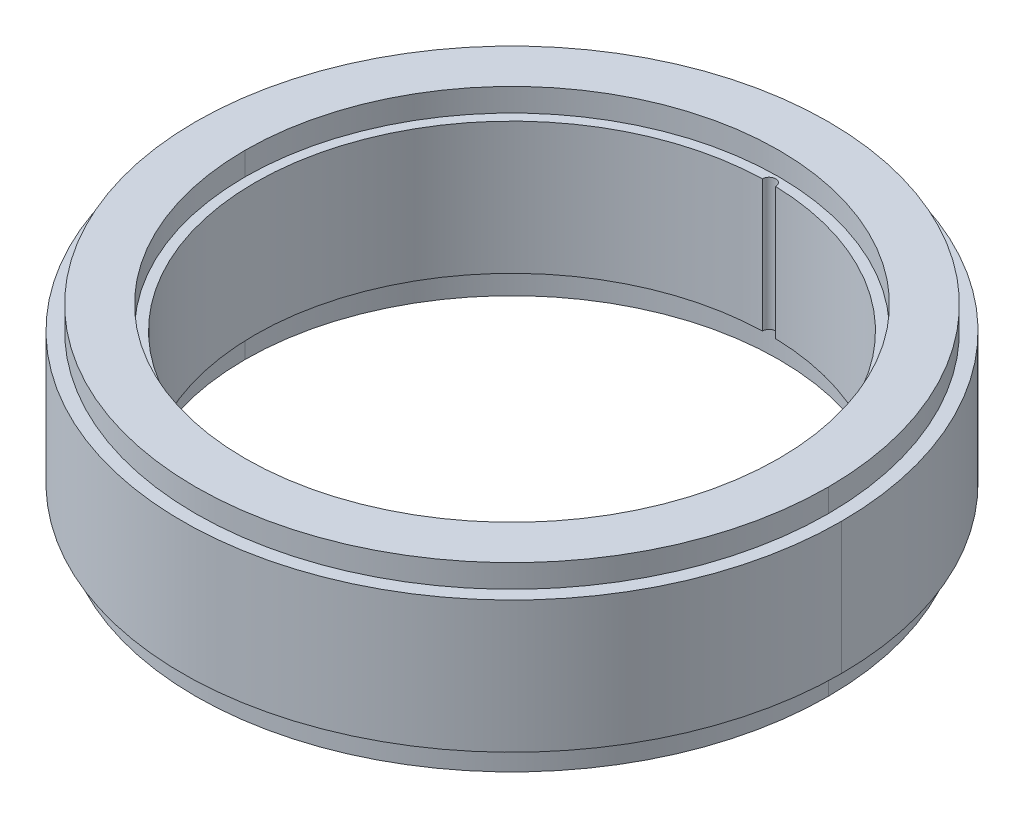
ISO-10303-21;
HEADER;
FILE_DESCRIPTION(('STEP AP214'),'2;1');
FILE_NAME('part.step','',(''),(''),'','','');
FILE_SCHEMA(('AUTOMOTIVE_DESIGN { 1 0 10303 214 1 1 1 1 }'));
ENDSEC;
DATA;
#1=APPLICATION_CONTEXT('core data for automotive mechanical design processes');
#2=APPLICATION_PROTOCOL_DEFINITION('international standard','automotive_design',2000,#1);
#3=PRODUCT_CONTEXT('',#1,'mechanical');
#4=PRODUCT('Part','Part','',(#3));
#5=PRODUCT_RELATED_PRODUCT_CATEGORY('part','',(#4));
#6=PRODUCT_DEFINITION_FORMATION('','',#4);
#7=PRODUCT_DEFINITION_CONTEXT('part definition',#1,'design');
#8=PRODUCT_DEFINITION('design','',#6,#7);
#9=PRODUCT_DEFINITION_SHAPE('','',#8);
#10=(LENGTH_UNIT() NAMED_UNIT(*) SI_UNIT(.MILLI.,.METRE.));
#11=(NAMED_UNIT(*) PLANE_ANGLE_UNIT() SI_UNIT($,.RADIAN.));
#12=(NAMED_UNIT(*) SI_UNIT($,.STERADIAN.) SOLID_ANGLE_UNIT());
#13=UNCERTAINTY_MEASURE_WITH_UNIT(LENGTH_MEASURE(1.E-05),#10,'distance_accuracy_value','');
#14=(GEOMETRIC_REPRESENTATION_CONTEXT(3) GLOBAL_UNCERTAINTY_ASSIGNED_CONTEXT((#13)) GLOBAL_UNIT_ASSIGNED_CONTEXT((#10,
#11,#12)) REPRESENTATION_CONTEXT('',''));
#15=CARTESIAN_POINT('',(0.,0.,0.));
#16=DIRECTION('',(0.,0.,1.));
#17=DIRECTION('',(1.,0.,0.));
#18=AXIS2_PLACEMENT_3D('',#15,#16,#17);
#19=CARTESIAN_POINT('',(0.,0.,0.));
#20=DIRECTION('',(0.,1.,0.));
#21=DIRECTION('',(1.,0.,0.));
#22=AXIS2_PLACEMENT_3D('',#19,#20,#21);
#23=CYLINDRICAL_SURFACE('',#22,39.);
#24=CARTESIAN_POINT('',(0.,20.,0.));
#25=DIRECTION('',(0.,1.,0.));
#26=DIRECTION('',(0.025638918303801,0.,0.999671268902038));
#27=AXIS2_PLACEMENT_3D('',#24,#25,#26);
#28=CIRCLE('',#27,39.);
#29=CARTESIAN_POINT('',(0.9999178138482,20.,38.98717948718));
#30=VERTEX_POINT('',#29);
#31=CARTESIAN_POINT('',(39.,20.,0.));
#32=VERTEX_POINT('',#31);
#33=EDGE_CURVE('E324',#30,#32,#28,.T.);
#34=ORIENTED_EDGE('',*,*,#33,.T.);
#35=CARTESIAN_POINT('',(0.,20.,0.));
#36=DIRECTION('',(0.,1.,0.));
#37=DIRECTION('',(1.,0.,0.));
#38=AXIS2_PLACEMENT_3D('',#35,#36,#37);
#39=CIRCLE('',#38,39.);
#40=CARTESIAN_POINT('',(0.9999178138482,20.,-38.98717948718));
#41=VERTEX_POINT('',#40);
#42=EDGE_CURVE('E321',#32,#41,#39,.T.);
#43=ORIENTED_EDGE('',*,*,#42,.T.);
#44=DIRECTION('',(0.,-1.,0.));
#45=VECTOR('',#44,1.);
#46=CARTESIAN_POINT('',(0.9999178138482,20.,-38.98717948718));
#47=LINE('',#46,#45);
#48=CARTESIAN_POINT('',(0.9999178138482,0.,-38.98717948718));
#49=VERTEX_POINT('',#48);
#50=EDGE_CURVE('E311',#41,#49,#47,.T.);
#51=ORIENTED_EDGE('',*,*,#50,.T.);
#52=CARTESIAN_POINT('',(0.,0.,0.));
#53=DIRECTION('',(0.,-1.,0.));
#54=DIRECTION('',(0.025638918303801,0.,-0.999671268902038));
#55=AXIS2_PLACEMENT_3D('',#52,#53,#54);
#56=CIRCLE('',#55,39.);
#57=CARTESIAN_POINT('',(39.,0.,0.));
#58=VERTEX_POINT('',#57);
#59=EDGE_CURVE('E268',#49,#58,#56,.T.);
#60=ORIENTED_EDGE('',*,*,#59,.T.);
#61=CARTESIAN_POINT('',(0.,0.,0.));
#62=DIRECTION('',(0.,-1.,0.));
#63=DIRECTION('',(1.,0.,0.));
#64=AXIS2_PLACEMENT_3D('',#61,#62,#63);
#65=CIRCLE('',#64,39.);
#66=CARTESIAN_POINT('',(0.9999178138482,0.,38.98717948718));
#67=VERTEX_POINT('',#66);
#68=EDGE_CURVE('E276',#58,#67,#65,.T.);
#69=ORIENTED_EDGE('',*,*,#68,.T.);
#70=DIRECTION('',(0.,-1.,0.));
#71=VECTOR('',#70,1.);
#72=CARTESIAN_POINT('',(0.9999178138482,20.,38.98717948718));
#73=LINE('',#72,#71);
#74=EDGE_CURVE('E368',#30,#67,#73,.T.);
#75=ORIENTED_EDGE('',*,*,#74,.F.);
#76=EDGE_LOOP('',(#34,#43,#51,#60,#69,#75));
#77=FACE_BOUND('',#76,.T.);
#78=ADVANCED_FACE('F16',(#77),#23,.F.);
#79=CARTESIAN_POINT('',(0.,-8.,0.));
#80=DIRECTION('',(0.,-1.,0.));
#81=DIRECTION('',(0.,0.,-1.));
#82=AXIS2_PLACEMENT_3D('',#79,#80,#81);
#83=PLANE('',#82);
#84=CARTESIAN_POINT('',(-6.,-8.,-46.));
#85=DIRECTION('',(0.,1.,0.));
#86=DIRECTION('',(0.,0.,-1.));
#87=AXIS2_PLACEMENT_3D('',#84,#85,#86);
#88=CIRCLE('',#87,1.25);
#89=CARTESIAN_POINT('',(-6.,-8.,-47.25));
#90=VERTEX_POINT('',#89);
#91=CARTESIAN_POINT('',(-6.,-8.,-44.75));
#92=VERTEX_POINT('',#91);
#93=EDGE_CURVE('E10',#90,#92,#88,.T.);
#94=ORIENTED_EDGE('',*,*,#93,.F.);
#95=CARTESIAN_POINT('',(-6.,-8.,-46.));
#96=DIRECTION('',(0.,1.,0.));
#97=DIRECTION('',(0.,0.,1.));
#98=AXIS2_PLACEMENT_3D('',#95,#96,#97);
#99=CIRCLE('',#98,1.25);
#100=EDGE_CURVE('E20',#92,#90,#99,.T.);
#101=ORIENTED_EDGE('',*,*,#100,.F.);
#102=EDGE_LOOP('',(#94,#101));
#103=FACE_BOUND('',#102,.T.);
#104=ADVANCED_FACE('F540',(#103),#83,.T.);
#105=CARTESIAN_POINT('',(-6.,0.,-46.));
#106=DIRECTION('',(0.,-1.,0.));
#107=DIRECTION('',(0.,0.,-1.));
#108=AXIS2_PLACEMENT_3D('',#105,#106,#107);
#109=CYLINDRICAL_SURFACE('',#108,1.25);
#110=DIRECTION('',(0.,1.,0.));
#111=VECTOR('',#110,1.);
#112=CARTESIAN_POINT('',(-6.,-8.,-47.25));
#113=LINE('',#112,#111);
#114=CARTESIAN_POINT('',(-6.,-4.,-47.25));
#115=VERTEX_POINT('',#114);
#116=EDGE_CURVE('E27',#90,#115,#113,.T.);
#117=ORIENTED_EDGE('',*,*,#116,.F.);
#118=ORIENTED_EDGE('',*,*,#93,.T.);
#119=DIRECTION('',(0.,1.,0.));
#120=VECTOR('',#119,1.);
#121=CARTESIAN_POINT('',(-6.,-8.,-44.75));
#122=LINE('',#121,#120);
#123=CARTESIAN_POINT('',(-6.,-4.,-44.75));
#124=VERTEX_POINT('',#123);
#125=EDGE_CURVE('E314',#92,#124,#122,.T.);
#126=ORIENTED_EDGE('',*,*,#125,.T.);
#127=CARTESIAN_POINT('',(-6.,-4.,-46.));
#128=DIRECTION('',(0.,-1.,0.));
#129=DIRECTION('',(0.,0.,1.));
#130=AXIS2_PLACEMENT_3D('',#127,#128,#129);
#131=CIRCLE('',#130,1.25);
#132=EDGE_CURVE('E295',#124,#115,#131,.T.);
#133=ORIENTED_EDGE('',*,*,#132,.T.);
#134=EDGE_LOOP('',(#117,#118,#126,#133));
#135=FACE_BOUND('',#134,.T.);
#136=ADVANCED_FACE('F544',(#135),#109,.T.);
#137=CARTESIAN_POINT('',(-6.,0.,-46.));
#138=DIRECTION('',(0.,-1.,0.));
#139=DIRECTION('',(0.,0.,-1.));
#140=AXIS2_PLACEMENT_3D('',#137,#138,#139);
#141=CYLINDRICAL_SURFACE('',#140,1.25);
#142=ORIENTED_EDGE('',*,*,#125,.F.);
#143=ORIENTED_EDGE('',*,*,#100,.T.);
#144=ORIENTED_EDGE('',*,*,#116,.T.);
#145=CARTESIAN_POINT('',(-6.,-4.,-46.));
#146=DIRECTION('',(0.,-1.,0.));
#147=DIRECTION('',(0.,0.,-1.));
#148=AXIS2_PLACEMENT_3D('',#145,#146,#147);
#149=CIRCLE('',#148,1.25);
#150=EDGE_CURVE('E391',#115,#124,#149,.T.);
#151=ORIENTED_EDGE('',*,*,#150,.T.);
#152=EDGE_LOOP('',(#142,#143,#144,#151));
#153=FACE_BOUND('',#152,.T.);
#154=ADVANCED_FACE('F583',(#153),#141,.T.);
#155=CARTESIAN_POINT('',(0.,-8.,0.));
#156=DIRECTION('',(0.,-1.,0.));
#157=DIRECTION('',(0.,0.,-1.));
#158=AXIS2_PLACEMENT_3D('',#155,#156,#157);
#159=PLANE('',#158);
#160=CARTESIAN_POINT('',(6.,-8.,-46.));
#161=DIRECTION('',(0.,1.,0.));
#162=DIRECTION('',(0.,0.,-1.));
#163=AXIS2_PLACEMENT_3D('',#160,#161,#162);
#164=CIRCLE('',#163,1.25);
#165=CARTESIAN_POINT('',(6.,-8.,-47.25));
#166=VERTEX_POINT('',#165);
#167=CARTESIAN_POINT('',(6.,-8.,-44.75));
#168=VERTEX_POINT('',#167);
#169=EDGE_CURVE('E304',#166,#168,#164,.T.);
#170=ORIENTED_EDGE('',*,*,#169,.F.);
#171=CARTESIAN_POINT('',(6.,-8.,-46.));
#172=DIRECTION('',(0.,1.,0.));
#173=DIRECTION('',(0.,0.,1.));
#174=AXIS2_PLACEMENT_3D('',#171,#172,#173);
#175=CIRCLE('',#174,1.25);
#176=EDGE_CURVE('E305',#168,#166,#175,.T.);
#177=ORIENTED_EDGE('',*,*,#176,.F.);
#178=EDGE_LOOP('',(#170,#177));
#179=FACE_BOUND('',#178,.T.);
#180=ADVANCED_FACE('F564',(#179),#159,.T.);
#181=CARTESIAN_POINT('',(6.,0.,-46.));
#182=DIRECTION('',(0.,-1.,0.));
#183=DIRECTION('',(0.,0.,-1.));
#184=AXIS2_PLACEMENT_3D('',#181,#182,#183);
#185=CYLINDRICAL_SURFACE('',#184,1.25);
#186=DIRECTION('',(0.,1.,0.));
#187=VECTOR('',#186,1.);
#188=CARTESIAN_POINT('',(6.,-8.,-47.25));
#189=LINE('',#188,#187);
#190=CARTESIAN_POINT('',(6.,-4.,-47.25));
#191=VERTEX_POINT('',#190);
#192=EDGE_CURVE('E301',#166,#191,#189,.T.);
#193=ORIENTED_EDGE('',*,*,#192,.F.);
#194=ORIENTED_EDGE('',*,*,#169,.T.);
#195=DIRECTION('',(0.,1.,0.));
#196=VECTOR('',#195,1.);
#197=CARTESIAN_POINT('',(6.,-8.,-44.75));
#198=LINE('',#197,#196);
#199=CARTESIAN_POINT('',(6.,-4.,-44.75));
#200=VERTEX_POINT('',#199);
#201=EDGE_CURVE('E300',#168,#200,#198,.T.);
#202=ORIENTED_EDGE('',*,*,#201,.T.);
#203=CARTESIAN_POINT('',(6.,-4.,-46.));
#204=DIRECTION('',(0.,-1.,0.));
#205=DIRECTION('',(0.,0.,1.));
#206=AXIS2_PLACEMENT_3D('',#203,#204,#205);
#207=CIRCLE('',#206,1.25);
#208=EDGE_CURVE('E296',#200,#191,#207,.T.);
#209=ORIENTED_EDGE('',*,*,#208,.T.);
#210=EDGE_LOOP('',(#193,#194,#202,#209));
#211=FACE_BOUND('',#210,.T.);
#212=ADVANCED_FACE('F534',(#211),#185,.T.);
#213=CARTESIAN_POINT('',(6.,0.,-46.));
#214=DIRECTION('',(0.,-1.,0.));
#215=DIRECTION('',(0.,0.,-1.));
#216=AXIS2_PLACEMENT_3D('',#213,#214,#215);
#217=CYLINDRICAL_SURFACE('',#216,1.25);
#218=ORIENTED_EDGE('',*,*,#201,.F.);
#219=ORIENTED_EDGE('',*,*,#176,.T.);
#220=ORIENTED_EDGE('',*,*,#192,.T.);
#221=CARTESIAN_POINT('',(6.,-4.,-46.));
#222=DIRECTION('',(0.,-1.,0.));
#223=DIRECTION('',(0.,0.,-1.));
#224=AXIS2_PLACEMENT_3D('',#221,#222,#223);
#225=CIRCLE('',#224,1.25);
#226=EDGE_CURVE('E291',#191,#200,#225,.T.);
#227=ORIENTED_EDGE('',*,*,#226,.T.);
#228=EDGE_LOOP('',(#218,#219,#220,#227));
#229=FACE_BOUND('',#228,.T.);
#230=ADVANCED_FACE('F526',(#229),#217,.T.);
#231=CARTESIAN_POINT('',(0.,-8.,0.));
#232=DIRECTION('',(0.,-1.,0.));
#233=DIRECTION('',(0.,0.,-1.));
#234=AXIS2_PLACEMENT_3D('',#231,#232,#233);
#235=PLANE('',#234);
#236=CARTESIAN_POINT('',(0.,-8.,-46.));
#237=DIRECTION('',(0.,1.,0.));
#238=DIRECTION('',(0.,0.,-1.));
#239=AXIS2_PLACEMENT_3D('',#236,#237,#238);
#240=CIRCLE('',#239,1.25);
#241=CARTESIAN_POINT('',(0.,-8.,-47.25));
#242=VERTEX_POINT('',#241);
#243=CARTESIAN_POINT('',(0.,-8.,-44.75));
#244=VERTEX_POINT('',#243);
#245=EDGE_CURVE('E297',#242,#244,#240,.T.);
#246=ORIENTED_EDGE('',*,*,#245,.F.);
#247=CARTESIAN_POINT('',(0.,-8.,-46.));
#248=DIRECTION('',(0.,1.,0.));
#249=DIRECTION('',(0.,0.,1.));
#250=AXIS2_PLACEMENT_3D('',#247,#248,#249);
#251=CIRCLE('',#250,1.25);
#252=EDGE_CURVE('E282',#244,#242,#251,.T.);
#253=ORIENTED_EDGE('',*,*,#252,.F.);
#254=EDGE_LOOP('',(#246,#253));
#255=FACE_BOUND('',#254,.T.);
#256=ADVANCED_FACE('F524',(#255),#235,.T.);
#257=CARTESIAN_POINT('',(0.,0.,-46.));
#258=DIRECTION('',(0.,-1.,0.));
#259=DIRECTION('',(0.,0.,-1.));
#260=AXIS2_PLACEMENT_3D('',#257,#258,#259);
#261=CYLINDRICAL_SURFACE('',#260,1.25);
#262=DIRECTION('',(0.,1.,0.));
#263=VECTOR('',#262,1.);
#264=CARTESIAN_POINT('',(0.,-8.,-47.25));
#265=LINE('',#264,#263);
#266=CARTESIAN_POINT('',(0.,-4.,-47.25));
#267=VERTEX_POINT('',#266);
#268=EDGE_CURVE('E285',#242,#267,#265,.T.);
#269=ORIENTED_EDGE('',*,*,#268,.F.);
#270=ORIENTED_EDGE('',*,*,#245,.T.);
#271=DIRECTION('',(0.,1.,0.));
#272=VECTOR('',#271,1.);
#273=CARTESIAN_POINT('',(0.,-8.,-44.75));
#274=LINE('',#273,#272);
#275=CARTESIAN_POINT('',(0.,-4.,-44.75));
#276=VERTEX_POINT('',#275);
#277=EDGE_CURVE('E286',#244,#276,#274,.T.);
#278=ORIENTED_EDGE('',*,*,#277,.T.);
#279=CARTESIAN_POINT('',(0.,-4.,-46.));
#280=DIRECTION('',(0.,-1.,0.));
#281=DIRECTION('',(0.,0.,1.));
#282=AXIS2_PLACEMENT_3D('',#279,#280,#281);
#283=CIRCLE('',#282,1.25);
#284=EDGE_CURVE('E341',#276,#267,#283,.T.);
#285=ORIENTED_EDGE('',*,*,#284,.T.);
#286=EDGE_LOOP('',(#269,#270,#278,#285));
#287=FACE_BOUND('',#286,.T.);
#288=ADVANCED_FACE('F520',(#287),#261,.T.);
#289=CARTESIAN_POINT('',(0.,0.,-46.));
#290=DIRECTION('',(0.,-1.,0.));
#291=DIRECTION('',(0.,0.,-1.));
#292=AXIS2_PLACEMENT_3D('',#289,#290,#291);
#293=CYLINDRICAL_SURFACE('',#292,1.25);
#294=ORIENTED_EDGE('',*,*,#277,.F.);
#295=ORIENTED_EDGE('',*,*,#252,.T.);
#296=ORIENTED_EDGE('',*,*,#268,.T.);
#297=CARTESIAN_POINT('',(0.,-4.,-46.));
#298=DIRECTION('',(0.,-1.,0.));
#299=DIRECTION('',(0.,0.,-1.));
#300=AXIS2_PLACEMENT_3D('',#297,#298,#299);
#301=CIRCLE('',#300,1.25);
#302=EDGE_CURVE('E395',#267,#276,#301,.T.);
#303=ORIENTED_EDGE('',*,*,#302,.T.);
#304=EDGE_LOOP('',(#294,#295,#296,#303));
#305=FACE_BOUND('',#304,.T.);
#306=ADVANCED_FACE('F522',(#305),#293,.T.);
#307=CARTESIAN_POINT('',(0.,-4.,0.));
#308=DIRECTION('',(0.,1.,0.));
#309=DIRECTION('',(1.,0.,0.));
#310=AXIS2_PLACEMENT_3D('',#307,#308,#309);
#311=CYLINDRICAL_SURFACE('',#310,48.);
#312=CARTESIAN_POINT('',(0.,0.,0.));
#313=DIRECTION('',(0.,-1.,0.));
#314=DIRECTION('',(1.,0.,0.));
#315=AXIS2_PLACEMENT_3D('',#312,#313,#314);
#316=CIRCLE('',#315,48.);
#317=CARTESIAN_POINT('',(48.,0.,0.));
#318=VERTEX_POINT('',#317);
#319=CARTESIAN_POINT('',(-48.,0.,0.));
#320=VERTEX_POINT('',#319);
#321=EDGE_CURVE('E420',#318,#320,#316,.T.);
#322=ORIENTED_EDGE('',*,*,#321,.T.);
#323=DIRECTION('',(0.,-1.,0.));
#324=VECTOR('',#323,1.);
#325=CARTESIAN_POINT('',(-48.,0.,0.));
#326=LINE('',#325,#324);
#327=CARTESIAN_POINT('',(-48.,-4.,0.));
#328=VERTEX_POINT('',#327);
#329=EDGE_CURVE('E387',#320,#328,#326,.T.);
#330=ORIENTED_EDGE('',*,*,#329,.T.);
#331=CARTESIAN_POINT('',(0.,-4.,0.));
#332=DIRECTION('',(0.,1.,0.));
#333=DIRECTION('',(-1.,0.,0.));
#334=AXIS2_PLACEMENT_3D('',#331,#332,#333);
#335=CIRCLE('',#334,48.);
#336=CARTESIAN_POINT('',(48.,-4.,0.));
#337=VERTEX_POINT('',#336);
#338=EDGE_CURVE('E256',#328,#337,#335,.T.);
#339=ORIENTED_EDGE('',*,*,#338,.T.);
#340=DIRECTION('',(0.,-1.,0.));
#341=VECTOR('',#340,1.);
#342=CARTESIAN_POINT('',(48.,0.,0.));
#343=LINE('',#342,#341);
#344=EDGE_CURVE('E390',#318,#337,#343,.T.);
#345=ORIENTED_EDGE('',*,*,#344,.F.);
#346=EDGE_LOOP('',(#322,#330,#339,#345));
#347=FACE_BOUND('',#346,.T.);
#348=ADVANCED_FACE('F546',(#347),#311,.T.);
#349=CARTESIAN_POINT('',(0.,-4.,0.));
#350=DIRECTION('',(0.,1.,0.));
#351=DIRECTION('',(1.,0.,0.));
#352=AXIS2_PLACEMENT_3D('',#349,#350,#351);
#353=CYLINDRICAL_SURFACE('',#352,48.);
#354=CARTESIAN_POINT('',(0.,-4.,0.));
#355=DIRECTION('',(0.,1.,0.));
#356=DIRECTION('',(1.,0.,0.));
#357=AXIS2_PLACEMENT_3D('',#354,#355,#356);
#358=CIRCLE('',#357,48.);
#359=EDGE_CURVE('E290',#337,#328,#358,.T.);
#360=ORIENTED_EDGE('',*,*,#359,.T.);
#361=ORIENTED_EDGE('',*,*,#329,.F.);
#362=CARTESIAN_POINT('',(0.,0.,0.));
#363=DIRECTION('',(0.,-1.,0.));
#364=DIRECTION('',(-1.,0.,0.));
#365=AXIS2_PLACEMENT_3D('',#362,#363,#364);
#366=CIRCLE('',#365,48.);
#367=EDGE_CURVE('E417',#320,#318,#366,.T.);
#368=ORIENTED_EDGE('',*,*,#367,.T.);
#369=ORIENTED_EDGE('',*,*,#344,.T.);
#370=EDGE_LOOP('',(#360,#361,#368,#369));
#371=FACE_BOUND('',#370,.T.);
#372=ADVANCED_FACE('F549',(#371),#353,.T.);
#373=CARTESIAN_POINT('',(0.,-4.,0.));
#374=DIRECTION('',(0.,1.,0.));
#375=DIRECTION('',(1.,0.,0.));
#376=AXIS2_PLACEMENT_3D('',#373,#374,#375);
#377=PLANE('',#376);
#378=ORIENTED_EDGE('',*,*,#132,.F.);
#379=ORIENTED_EDGE('',*,*,#150,.F.);
#380=EDGE_LOOP('',(#378,#379));
#381=FACE_BOUND('',#380,.T.);
#382=ORIENTED_EDGE('',*,*,#208,.F.);
#383=ORIENTED_EDGE('',*,*,#226,.F.);
#384=EDGE_LOOP('',(#382,#383));
#385=FACE_BOUND('',#384,.T.);
#386=ORIENTED_EDGE('',*,*,#284,.F.);
#387=ORIENTED_EDGE('',*,*,#302,.F.);
#388=EDGE_LOOP('',(#386,#387));
#389=FACE_BOUND('',#388,.T.);
#390=CARTESIAN_POINT('',(0.,-4.,0.));
#391=DIRECTION('',(0.,-1.,0.));
#392=DIRECTION('',(-1.,0.,0.));
#393=AXIS2_PLACEMENT_3D('',#390,#391,#392);
#394=CIRCLE('',#393,40.5);
#395=CARTESIAN_POINT('',(-40.5,-4.,0.));
#396=VERTEX_POINT('',#395);
#397=CARTESIAN_POINT('',(40.5,-4.,0.));
#398=VERTEX_POINT('',#397);
#399=EDGE_CURVE('E245',#396,#398,#394,.T.);
#400=ORIENTED_EDGE('',*,*,#399,.F.);
#401=CARTESIAN_POINT('',(0.,-4.,0.));
#402=DIRECTION('',(0.,-1.,0.));
#403=DIRECTION('',(1.,0.,0.));
#404=AXIS2_PLACEMENT_3D('',#401,#402,#403);
#405=CIRCLE('',#404,40.5);
#406=EDGE_CURVE('E260',#398,#396,#405,.T.);
#407=ORIENTED_EDGE('',*,*,#406,.F.);
#408=EDGE_LOOP('',(#400,#407));
#409=FACE_BOUND('',#408,.T.);
#410=ORIENTED_EDGE('',*,*,#338,.F.);
#411=ORIENTED_EDGE('',*,*,#359,.F.);
#412=EDGE_LOOP('',(#410,#411));
#413=FACE_BOUND('',#412,.T.);
#414=ADVANCED_FACE('F18',(#381,#385,#389,#409,#413),#377,.F.);
#415=CARTESIAN_POINT('',(0.,-4.,0.));
#416=DIRECTION('',(0.,1.,0.));
#417=DIRECTION('',(1.,0.,0.));
#418=AXIS2_PLACEMENT_3D('',#415,#416,#417);
#419=CYLINDRICAL_SURFACE('',#418,40.5);
#420=CARTESIAN_POINT('',(0.,0.,0.));
#421=DIRECTION('',(0.,1.,0.));
#422=DIRECTION('',(1.,0.,0.));
#423=AXIS2_PLACEMENT_3D('',#420,#421,#422);
#424=CIRCLE('',#423,40.5);
#425=CARTESIAN_POINT('',(40.5,0.,0.));
#426=VERTEX_POINT('',#425);
#427=CARTESIAN_POINT('',(-40.5,0.,0.));
#428=VERTEX_POINT('',#427);
#429=EDGE_CURVE('E334',#426,#428,#424,.T.);
#430=ORIENTED_EDGE('',*,*,#429,.T.);
#431=DIRECTION('',(0.,-1.,0.));
#432=VECTOR('',#431,1.);
#433=CARTESIAN_POINT('',(-40.5,0.,0.));
#434=LINE('',#433,#432);
#435=EDGE_CURVE('E251',#428,#396,#434,.T.);
#436=ORIENTED_EDGE('',*,*,#435,.T.);
#437=ORIENTED_EDGE('',*,*,#399,.T.);
#438=DIRECTION('',(0.,-1.,0.));
#439=VECTOR('',#438,1.);
#440=CARTESIAN_POINT('',(40.5,0.,0.));
#441=LINE('',#440,#439);
#442=EDGE_CURVE('E249',#426,#398,#441,.T.);
#443=ORIENTED_EDGE('',*,*,#442,.F.);
#444=EDGE_LOOP('',(#430,#436,#437,#443));
#445=FACE_BOUND('',#444,.T.);
#446=ADVANCED_FACE('F248',(#445),#419,.F.);
#447=CARTESIAN_POINT('',(0.,-4.,0.));
#448=DIRECTION('',(0.,1.,0.));
#449=DIRECTION('',(1.,0.,0.));
#450=AXIS2_PLACEMENT_3D('',#447,#448,#449);
#451=CYLINDRICAL_SURFACE('',#450,40.5);
#452=ORIENTED_EDGE('',*,*,#406,.T.);
#453=ORIENTED_EDGE('',*,*,#435,.F.);
#454=CARTESIAN_POINT('',(0.,0.,0.));
#455=DIRECTION('',(0.,1.,0.));
#456=DIRECTION('',(-1.,0.,0.));
#457=AXIS2_PLACEMENT_3D('',#454,#455,#456);
#458=CIRCLE('',#457,40.5);
#459=EDGE_CURVE('E262',#428,#426,#458,.T.);
#460=ORIENTED_EDGE('',*,*,#459,.T.);
#461=ORIENTED_EDGE('',*,*,#442,.T.);
#462=EDGE_LOOP('',(#452,#453,#460,#461));
#463=FACE_BOUND('',#462,.T.);
#464=ADVANCED_FACE('F259',(#463),#451,.F.);
#465=CARTESIAN_POINT('',(0.,0.,0.));
#466=DIRECTION('',(0.,1.,0.));
#467=DIRECTION('',(1.,0.,0.));
#468=AXIS2_PLACEMENT_3D('',#465,#466,#467);
#469=PLANE('',#468);
#470=ORIENTED_EDGE('',*,*,#68,.F.);
#471=ORIENTED_EDGE('',*,*,#59,.F.);
#472=CARTESIAN_POINT('',(0.,0.,-39.));
#473=DIRECTION('',(0.,-1.,0.));
#474=DIRECTION('',(1.,0.,0.));
#475=AXIS2_PLACEMENT_3D('',#472,#473,#474);
#476=CIRCLE('',#475,1.);
#477=CARTESIAN_POINT('',(1.,0.,-39.));
#478=VERTEX_POINT('',#477);
#479=EDGE_CURVE('E337',#478,#49,#476,.T.);
#480=ORIENTED_EDGE('',*,*,#479,.F.);
#481=CARTESIAN_POINT('',(0.,0.,-39.));
#482=DIRECTION('',(0.,-1.,0.));
#483=DIRECTION('',(-1.,0.,0.));
#484=AXIS2_PLACEMENT_3D('',#481,#482,#483);
#485=CIRCLE('',#484,1.);
#486=CARTESIAN_POINT('',(-1.,0.,-39.));
#487=VERTEX_POINT('',#486);
#488=EDGE_CURVE('E310',#487,#478,#485,.T.);
#489=ORIENTED_EDGE('',*,*,#488,.F.);
#490=CARTESIAN_POINT('',(0.,0.,-39.));
#491=DIRECTION('',(0.,-1.,0.));
#492=DIRECTION('',(-0.999917813848228,0.,0.0128205128205104));
#493=AXIS2_PLACEMENT_3D('',#490,#491,#492);
#494=CIRCLE('',#493,1.);
#495=CARTESIAN_POINT('',(-0.9999178138482,0.,-38.98717948718));
#496=VERTEX_POINT('',#495);
#497=EDGE_CURVE('E306',#496,#487,#494,.T.);
#498=ORIENTED_EDGE('',*,*,#497,.F.);
#499=CARTESIAN_POINT('',(0.,0.,0.));
#500=DIRECTION('',(0.,-1.,0.));
#501=DIRECTION('',(-1.,0.,0.));
#502=AXIS2_PLACEMENT_3D('',#499,#500,#501);
#503=CIRCLE('',#502,39.);
#504=CARTESIAN_POINT('',(-39.,0.,0.));
#505=VERTEX_POINT('',#504);
#506=EDGE_CURVE('E364',#505,#496,#503,.T.);
#507=ORIENTED_EDGE('',*,*,#506,.F.);
#508=CARTESIAN_POINT('',(0.,0.,0.));
#509=DIRECTION('',(0.,-1.,0.));
#510=DIRECTION('',(-0.025638918303801,0.,0.999671268902038));
#511=AXIS2_PLACEMENT_3D('',#508,#509,#510);
#512=CIRCLE('',#511,39.);
#513=CARTESIAN_POINT('',(-0.9999178138482,0.,38.98717948718));
#514=VERTEX_POINT('',#513);
#515=EDGE_CURVE('E360',#514,#505,#512,.T.);
#516=ORIENTED_EDGE('',*,*,#515,.F.);
#517=CARTESIAN_POINT('',(0.,0.,39.));
#518=DIRECTION('',(0.,-1.,0.));
#519=DIRECTION('',(-1.,0.,0.));
#520=AXIS2_PLACEMENT_3D('',#517,#518,#519);
#521=CIRCLE('',#520,1.);
#522=CARTESIAN_POINT('',(-1.,0.,39.));
#523=VERTEX_POINT('',#522);
#524=EDGE_CURVE('E280',#523,#514,#521,.T.);
#525=ORIENTED_EDGE('',*,*,#524,.F.);
#526=CARTESIAN_POINT('',(0.,0.,39.));
#527=DIRECTION('',(0.,-1.,0.));
#528=DIRECTION('',(1.,0.,0.));
#529=AXIS2_PLACEMENT_3D('',#526,#527,#528);
#530=CIRCLE('',#529,1.);
#531=CARTESIAN_POINT('',(1.,0.,39.));
#532=VERTEX_POINT('',#531);
#533=EDGE_CURVE('E342',#532,#523,#530,.T.);
#534=ORIENTED_EDGE('',*,*,#533,.F.);
#535=CARTESIAN_POINT('',(0.,0.,39.));
#536=DIRECTION('',(0.,-1.,0.));
#537=DIRECTION('',(0.999917813848228,0.,-0.0128205128205104));
#538=AXIS2_PLACEMENT_3D('',#535,#536,#537);
#539=CIRCLE('',#538,1.);
#540=EDGE_CURVE('E346',#67,#532,#539,.T.);
#541=ORIENTED_EDGE('',*,*,#540,.F.);
#542=EDGE_LOOP('',(#470,#471,#480,#489,#498,#507,#516,#525,#534,#541));
#543=FACE_BOUND('',#542,.T.);
#544=ORIENTED_EDGE('',*,*,#429,.F.);
#545=ORIENTED_EDGE('',*,*,#459,.F.);
#546=EDGE_LOOP('',(#544,#545));
#547=FACE_BOUND('',#546,.T.);
#548=ADVANCED_FACE('F486',(#543,#547),#469,.F.);
#549=CARTESIAN_POINT('',(0.,20.,-39.));
#550=DIRECTION('',(0.,1.,0.));
#551=DIRECTION('',(1.,0.,0.));
#552=AXIS2_PLACEMENT_3D('',#549,#550,#551);
#553=CYLINDRICAL_SURFACE('',#552,1.);
#554=ORIENTED_EDGE('',*,*,#50,.F.);
#555=CARTESIAN_POINT('',(0.,20.,-39.));
#556=DIRECTION('',(0.,1.,0.));
#557=DIRECTION('',(0.999917813848228,0.,0.0128205128205104));
#558=AXIS2_PLACEMENT_3D('',#555,#556,#557);
#559=CIRCLE('',#558,1.);
#560=CARTESIAN_POINT('',(1.,20.,-39.));
#561=VERTEX_POINT('',#560);
#562=EDGE_CURVE('E325',#41,#561,#559,.T.);
#563=ORIENTED_EDGE('',*,*,#562,.T.);
#564=CARTESIAN_POINT('',(0.,20.,-39.));
#565=DIRECTION('',(0.,1.,0.));
#566=DIRECTION('',(1.,0.,0.));
#567=AXIS2_PLACEMENT_3D('',#564,#565,#566);
#568=CIRCLE('',#567,1.);
#569=CARTESIAN_POINT('',(-1.,20.,-39.));
#570=VERTEX_POINT('',#569);
#571=EDGE_CURVE('E191',#561,#570,#568,.T.);
#572=ORIENTED_EDGE('',*,*,#571,.T.);
#573=CARTESIAN_POINT('',(0.,20.,-39.));
#574=DIRECTION('',(0.,1.,0.));
#575=DIRECTION('',(-1.,0.,0.));
#576=AXIS2_PLACEMENT_3D('',#573,#574,#575);
#577=CIRCLE('',#576,1.);
#578=CARTESIAN_POINT('',(-0.9999178138482,20.,-38.98717948718));
#579=VERTEX_POINT('',#578);
#580=EDGE_CURVE('E330',#570,#579,#577,.T.);
#581=ORIENTED_EDGE('',*,*,#580,.T.);
#582=DIRECTION('',(0.,-1.,0.));
#583=VECTOR('',#582,1.);
#584=CARTESIAN_POINT('',(-0.9999178138482,20.,-38.98717948718));
#585=LINE('',#584,#583);
#586=EDGE_CURVE('E180',#579,#496,#585,.T.);
#587=ORIENTED_EDGE('',*,*,#586,.T.);
#588=ORIENTED_EDGE('',*,*,#497,.T.);
#589=ORIENTED_EDGE('',*,*,#488,.T.);
#590=ORIENTED_EDGE('',*,*,#479,.T.);
#591=EDGE_LOOP('',(#554,#563,#572,#581,#587,#588,#589,#590));
#592=FACE_BOUND('',#591,.T.);
#593=ADVANCED_FACE('F498',(#592),#553,.F.);
#594=CARTESIAN_POINT('',(0.,0.,0.));
#595=DIRECTION('',(0.,1.,0.));
#596=DIRECTION('',(1.,0.,0.));
#597=AXIS2_PLACEMENT_3D('',#594,#595,#596);
#598=CYLINDRICAL_SURFACE('',#597,39.);
#599=ORIENTED_EDGE('',*,*,#515,.T.);
#600=ORIENTED_EDGE('',*,*,#506,.T.);
#601=ORIENTED_EDGE('',*,*,#586,.F.);
#602=CARTESIAN_POINT('',(0.,20.,0.));
#603=DIRECTION('',(0.,1.,0.));
#604=DIRECTION('',(-0.025638918303801,0.,-0.999671268902038));
#605=AXIS2_PLACEMENT_3D('',#602,#603,#604);
#606=CIRCLE('',#605,39.);
#607=CARTESIAN_POINT('',(-39.,20.,0.));
#608=VERTEX_POINT('',#607);
#609=EDGE_CURVE('E333',#579,#608,#606,.T.);
#610=ORIENTED_EDGE('',*,*,#609,.T.);
#611=CARTESIAN_POINT('',(0.,20.,0.));
#612=DIRECTION('',(0.,1.,0.));
#613=DIRECTION('',(-1.,0.,0.));
#614=AXIS2_PLACEMENT_3D('',#611,#612,#613);
#615=CIRCLE('',#614,39.);
#616=CARTESIAN_POINT('',(-0.9999178138482,20.,38.98717948718));
#617=VERTEX_POINT('',#616);
#618=EDGE_CURVE('E355',#608,#617,#615,.T.);
#619=ORIENTED_EDGE('',*,*,#618,.T.);
#620=DIRECTION('',(0.,-1.,0.));
#621=VECTOR('',#620,1.);
#622=CARTESIAN_POINT('',(-0.9999178138482,20.,38.98717948718));
#623=LINE('',#622,#621);
#624=EDGE_CURVE('E365',#617,#514,#623,.T.);
#625=ORIENTED_EDGE('',*,*,#624,.T.);
#626=EDGE_LOOP('',(#599,#600,#601,#610,#619,#625));
#627=FACE_BOUND('',#626,.T.);
#628=ADVANCED_FACE('F571',(#627),#598,.F.);
#629=CARTESIAN_POINT('',(0.,20.,39.));
#630=DIRECTION('',(0.,-1.,0.));
#631=DIRECTION('',(1.,0.,0.));
#632=AXIS2_PLACEMENT_3D('',#629,#630,#631);
#633=CYLINDRICAL_SURFACE('',#632,1.);
#634=ORIENTED_EDGE('',*,*,#74,.T.);
#635=ORIENTED_EDGE('',*,*,#540,.T.);
#636=ORIENTED_EDGE('',*,*,#533,.T.);
#637=ORIENTED_EDGE('',*,*,#524,.T.);
#638=ORIENTED_EDGE('',*,*,#624,.F.);
#639=CARTESIAN_POINT('',(0.,20.,39.));
#640=DIRECTION('',(0.,1.,0.));
#641=DIRECTION('',(-0.999917813848228,0.,-0.0128205128205104));
#642=AXIS2_PLACEMENT_3D('',#639,#640,#641);
#643=CIRCLE('',#642,1.);
#644=CARTESIAN_POINT('',(-1.,20.,39.));
#645=VERTEX_POINT('',#644);
#646=EDGE_CURVE('E372',#617,#645,#643,.T.);
#647=ORIENTED_EDGE('',*,*,#646,.T.);
#648=CARTESIAN_POINT('',(0.,20.,39.));
#649=DIRECTION('',(0.,1.,0.));
#650=DIRECTION('',(-1.,0.,0.));
#651=AXIS2_PLACEMENT_3D('',#648,#649,#650);
#652=CIRCLE('',#651,1.);
#653=CARTESIAN_POINT('',(1.,20.,39.));
#654=VERTEX_POINT('',#653);
#655=EDGE_CURVE('E425',#645,#654,#652,.T.);
#656=ORIENTED_EDGE('',*,*,#655,.T.);
#657=CARTESIAN_POINT('',(0.,20.,39.));
#658=DIRECTION('',(0.,1.,0.));
#659=DIRECTION('',(1.,0.,0.));
#660=AXIS2_PLACEMENT_3D('',#657,#658,#659);
#661=CIRCLE('',#660,1.);
#662=EDGE_CURVE('E428',#654,#30,#661,.T.);
#663=ORIENTED_EDGE('',*,*,#662,.T.);
#664=EDGE_LOOP('',(#634,#635,#636,#637,#638,#647,#656,#663));
#665=FACE_BOUND('',#664,.T.);
#666=ADVANCED_FACE('F481',(#665),#633,.F.);
#667=CARTESIAN_POINT('',(0.,-4.,0.));
#668=DIRECTION('',(0.,1.,0.));
#669=DIRECTION('',(1.,0.,0.));
#670=AXIS2_PLACEMENT_3D('',#667,#668,#669);
#671=CYLINDRICAL_SURFACE('',#670,40.5);
#672=DIRECTION('',(0.,-1.,0.));
#673=VECTOR('',#672,1.);
#674=CARTESIAN_POINT('',(40.5,23.5,0.));
#675=LINE('',#674,#673);
#676=CARTESIAN_POINT('',(40.5,23.5,0.));
#677=VERTEX_POINT('',#676);
#678=CARTESIAN_POINT('',(40.5,20.,0.));
#679=VERTEX_POINT('',#678);
#680=EDGE_CURVE('E434',#677,#679,#675,.T.);
#681=ORIENTED_EDGE('',*,*,#680,.F.);
#682=CARTESIAN_POINT('',(0.,23.5,0.));
#683=DIRECTION('',(0.,1.,0.));
#684=DIRECTION('',(1.,0.,0.));
#685=AXIS2_PLACEMENT_3D('',#682,#683,#684);
#686=CIRCLE('',#685,40.5);
#687=CARTESIAN_POINT('',(-40.5,23.5,0.));
#688=VERTEX_POINT('',#687);
#689=EDGE_CURVE('E347',#677,#688,#686,.T.);
#690=ORIENTED_EDGE('',*,*,#689,.T.);
#691=DIRECTION('',(0.,-1.,0.));
#692=VECTOR('',#691,1.);
#693=CARTESIAN_POINT('',(-40.5,23.5,0.));
#694=LINE('',#693,#692);
#695=CARTESIAN_POINT('',(-40.5,20.,0.));
#696=VERTEX_POINT('',#695);
#697=EDGE_CURVE('E439',#688,#696,#694,.T.);
#698=ORIENTED_EDGE('',*,*,#697,.T.);
#699=CARTESIAN_POINT('',(0.,20.,0.));
#700=DIRECTION('',(0.,-1.,0.));
#701=DIRECTION('',(-1.,0.,0.));
#702=AXIS2_PLACEMENT_3D('',#699,#700,#701);
#703=CIRCLE('',#702,40.5);
#704=EDGE_CURVE('E359',#696,#679,#703,.T.);
#705=ORIENTED_EDGE('',*,*,#704,.T.);
#706=EDGE_LOOP('',(#681,#690,#698,#705));
#707=FACE_BOUND('',#706,.T.);
#708=ADVANCED_FACE('F593',(#707),#671,.F.);
#709=CARTESIAN_POINT('',(0.,20.,0.));
#710=DIRECTION('',(0.,1.,0.));
#711=DIRECTION('',(1.,0.,0.));
#712=AXIS2_PLACEMENT_3D('',#709,#710,#711);
#713=PLANE('',#712);
#714=ORIENTED_EDGE('',*,*,#618,.F.);
#715=ORIENTED_EDGE('',*,*,#609,.F.);
#716=ORIENTED_EDGE('',*,*,#580,.F.);
#717=ORIENTED_EDGE('',*,*,#571,.F.);
#718=ORIENTED_EDGE('',*,*,#562,.F.);
#719=ORIENTED_EDGE('',*,*,#42,.F.);
#720=ORIENTED_EDGE('',*,*,#33,.F.);
#721=ORIENTED_EDGE('',*,*,#662,.F.);
#722=ORIENTED_EDGE('',*,*,#655,.F.);
#723=ORIENTED_EDGE('',*,*,#646,.F.);
#724=EDGE_LOOP('',(#714,#715,#716,#717,#718,#719,#720,#721,#722,#723));
#725=FACE_BOUND('',#724,.T.);
#726=ORIENTED_EDGE('',*,*,#704,.F.);
#727=CARTESIAN_POINT('',(0.,20.,0.));
#728=DIRECTION('',(0.,-1.,0.));
#729=DIRECTION('',(1.,0.,0.));
#730=AXIS2_PLACEMENT_3D('',#727,#728,#729);
#731=CIRCLE('',#730,40.5);
#732=EDGE_CURVE('E438',#679,#696,#731,.T.);
#733=ORIENTED_EDGE('',*,*,#732,.F.);
#734=EDGE_LOOP('',(#726,#733));
#735=FACE_BOUND('',#734,.T.);
#736=ADVANCED_FACE('F506',(#725,#735),#713,.T.);
#737=CARTESIAN_POINT('',(0.,-4.,0.));
#738=DIRECTION('',(0.,1.,0.));
#739=DIRECTION('',(1.,0.,0.));
#740=AXIS2_PLACEMENT_3D('',#737,#738,#739);
#741=CYLINDRICAL_SURFACE('',#740,40.5);
#742=ORIENTED_EDGE('',*,*,#697,.F.);
#743=CARTESIAN_POINT('',(0.,23.5,0.));
#744=DIRECTION('',(0.,1.,0.));
#745=DIRECTION('',(-1.,0.,0.));
#746=AXIS2_PLACEMENT_3D('',#743,#744,#745);
#747=CIRCLE('',#746,40.5);
#748=EDGE_CURVE('E351',#688,#677,#747,.T.);
#749=ORIENTED_EDGE('',*,*,#748,.T.);
#750=ORIENTED_EDGE('',*,*,#680,.T.);
#751=ORIENTED_EDGE('',*,*,#732,.T.);
#752=EDGE_LOOP('',(#742,#749,#750,#751));
#753=FACE_BOUND('',#752,.T.);
#754=ADVANCED_FACE('F557',(#753),#741,.F.);
#755=CARTESIAN_POINT('',(0.,23.5,0.));
#756=DIRECTION('',(0.,1.,0.));
#757=DIRECTION('',(1.,0.,0.));
#758=AXIS2_PLACEMENT_3D('',#755,#756,#757);
#759=PLANE('',#758);
#760=ORIENTED_EDGE('',*,*,#689,.F.);
#761=ORIENTED_EDGE('',*,*,#748,.F.);
#762=EDGE_LOOP('',(#760,#761));
#763=FACE_BOUND('',#762,.T.);
#764=CARTESIAN_POINT('',(0.,23.5,0.));
#765=DIRECTION('',(0.,-1.,0.));
#766=DIRECTION('',(1.,0.,0.));
#767=AXIS2_PLACEMENT_3D('',#764,#765,#766);
#768=CIRCLE('',#767,48.);
#769=CARTESIAN_POINT('',(48.,23.5,0.));
#770=VERTEX_POINT('',#769);
#771=CARTESIAN_POINT('',(-48.,23.5,0.));
#772=VERTEX_POINT('',#771);
#773=EDGE_CURVE('E352',#770,#772,#768,.T.);
#774=ORIENTED_EDGE('',*,*,#773,.F.);
#775=CARTESIAN_POINT('',(0.,23.5,0.));
#776=DIRECTION('',(0.,-1.,0.));
#777=DIRECTION('',(-1.,0.,0.));
#778=AXIS2_PLACEMENT_3D('',#775,#776,#777);
#779=CIRCLE('',#778,48.);
#780=EDGE_CURVE('E315',#772,#770,#779,.T.);
#781=ORIENTED_EDGE('',*,*,#780,.F.);
#782=EDGE_LOOP('',(#774,#781));
#783=FACE_BOUND('',#782,.T.);
#784=ADVANCED_FACE('F560',(#763,#783),#759,.T.);
#785=CARTESIAN_POINT('',(0.,-4.,0.));
#786=DIRECTION('',(0.,1.,0.));
#787=DIRECTION('',(1.,0.,0.));
#788=AXIS2_PLACEMENT_3D('',#785,#786,#787);
#789=CYLINDRICAL_SURFACE('',#788,48.);
#790=DIRECTION('',(0.,-1.,0.));
#791=VECTOR('',#790,1.);
#792=CARTESIAN_POINT('',(48.,23.5,0.));
#793=LINE('',#792,#791);
#794=CARTESIAN_POINT('',(48.,20.,0.));
#795=VERTEX_POINT('',#794);
#796=EDGE_CURVE('E319',#770,#795,#793,.T.);
#797=ORIENTED_EDGE('',*,*,#796,.F.);
#798=ORIENTED_EDGE('',*,*,#773,.T.);
#799=DIRECTION('',(0.,-1.,0.));
#800=VECTOR('',#799,1.);
#801=CARTESIAN_POINT('',(-48.,23.5,0.));
#802=LINE('',#801,#800);
#803=CARTESIAN_POINT('',(-48.,20.,0.));
#804=VERTEX_POINT('',#803);
#805=EDGE_CURVE('E320',#772,#804,#802,.T.);
#806=ORIENTED_EDGE('',*,*,#805,.T.);
#807=CARTESIAN_POINT('',(0.,20.,0.));
#808=DIRECTION('',(0.,1.,0.));
#809=DIRECTION('',(-1.,0.,0.));
#810=AXIS2_PLACEMENT_3D('',#807,#808,#809);
#811=CIRCLE('',#810,48.);
#812=EDGE_CURVE('E373',#804,#795,#811,.T.);
#813=ORIENTED_EDGE('',*,*,#812,.T.);
#814=EDGE_LOOP('',(#797,#798,#806,#813));
#815=FACE_BOUND('',#814,.T.);
#816=ADVANCED_FACE('F600',(#815),#789,.T.);
#817=CARTESIAN_POINT('',(0.,-4.,0.));
#818=DIRECTION('',(0.,1.,0.));
#819=DIRECTION('',(1.,0.,0.));
#820=AXIS2_PLACEMENT_3D('',#817,#818,#819);
#821=CYLINDRICAL_SURFACE('',#820,48.);
#822=ORIENTED_EDGE('',*,*,#805,.F.);
#823=ORIENTED_EDGE('',*,*,#780,.T.);
#824=ORIENTED_EDGE('',*,*,#796,.T.);
#825=CARTESIAN_POINT('',(0.,20.,0.));
#826=DIRECTION('',(0.,1.,0.));
#827=DIRECTION('',(1.,0.,0.));
#828=AXIS2_PLACEMENT_3D('',#825,#826,#827);
#829=CIRCLE('',#828,48.);
#830=EDGE_CURVE('E377',#795,#804,#829,.T.);
#831=ORIENTED_EDGE('',*,*,#830,.T.);
#832=EDGE_LOOP('',(#822,#823,#824,#831));
#833=FACE_BOUND('',#832,.T.);
#834=ADVANCED_FACE('F576',(#833),#821,.T.);
#835=CARTESIAN_POINT('',(0.,20.,0.));
#836=DIRECTION('',(0.,1.,0.));
#837=DIRECTION('',(1.,0.,0.));
#838=AXIS2_PLACEMENT_3D('',#835,#836,#837);
#839=PLANE('',#838);
#840=ORIENTED_EDGE('',*,*,#812,.F.);
#841=ORIENTED_EDGE('',*,*,#830,.F.);
#842=EDGE_LOOP('',(#840,#841));
#843=FACE_BOUND('',#842,.T.);
#844=CARTESIAN_POINT('',(0.,20.,0.));
#845=DIRECTION('',(0.,-1.,0.));
#846=DIRECTION('',(1.,0.,0.));
#847=AXIS2_PLACEMENT_3D('',#844,#845,#846);
#848=CIRCLE('',#847,50.);
#849=CARTESIAN_POINT('',(50.,20.,0.));
#850=VERTEX_POINT('',#849);
#851=CARTESIAN_POINT('',(-50.,20.,0.));
#852=VERTEX_POINT('',#851);
#853=EDGE_CURVE('E378',#850,#852,#848,.T.);
#854=ORIENTED_EDGE('',*,*,#853,.F.);
#855=CARTESIAN_POINT('',(0.,20.,0.));
#856=DIRECTION('',(0.,-1.,0.));
#857=DIRECTION('',(-1.,0.,0.));
#858=AXIS2_PLACEMENT_3D('',#855,#856,#857);
#859=CIRCLE('',#858,50.);
#860=EDGE_CURVE('E429',#852,#850,#859,.T.);
#861=ORIENTED_EDGE('',*,*,#860,.F.);
#862=EDGE_LOOP('',(#854,#861));
#863=FACE_BOUND('',#862,.T.);
#864=ADVANCED_FACE('F567',(#843,#863),#839,.T.);
#865=CARTESIAN_POINT('',(0.,0.,0.));
#866=DIRECTION('',(0.,1.,0.));
#867=DIRECTION('',(1.,0.,0.));
#868=AXIS2_PLACEMENT_3D('',#865,#866,#867);
#869=CYLINDRICAL_SURFACE('',#868,50.);
#870=DIRECTION('',(0.,-1.,0.));
#871=VECTOR('',#870,1.);
#872=CARTESIAN_POINT('',(50.,20.,0.));
#873=LINE('',#872,#871);
#874=CARTESIAN_POINT('',(50.,0.,0.));
#875=VERTEX_POINT('',#874);
#876=EDGE_CURVE('E433',#850,#875,#873,.T.);
#877=ORIENTED_EDGE('',*,*,#876,.F.);
#878=ORIENTED_EDGE('',*,*,#853,.T.);
#879=DIRECTION('',(0.,-1.,0.));
#880=VECTOR('',#879,1.);
#881=CARTESIAN_POINT('',(-50.,20.,0.));
#882=LINE('',#881,#880);
#883=CARTESIAN_POINT('',(-50.,0.,0.));
#884=VERTEX_POINT('',#883);
#885=EDGE_CURVE('E419',#852,#884,#882,.T.);
#886=ORIENTED_EDGE('',*,*,#885,.T.);
#887=CARTESIAN_POINT('',(0.,0.,0.));
#888=DIRECTION('',(0.,1.,0.));
#889=DIRECTION('',(-1.,0.,0.));
#890=AXIS2_PLACEMENT_3D('',#887,#888,#889);
#891=CIRCLE('',#890,50.);
#892=EDGE_CURVE('E382',#884,#875,#891,.T.);
#893=ORIENTED_EDGE('',*,*,#892,.T.);
#894=EDGE_LOOP('',(#877,#878,#886,#893));
#895=FACE_BOUND('',#894,.T.);
#896=ADVANCED_FACE('F555',(#895),#869,.T.);
#897=CARTESIAN_POINT('',(0.,0.,0.));
#898=DIRECTION('',(0.,1.,0.));
#899=DIRECTION('',(1.,0.,0.));
#900=AXIS2_PLACEMENT_3D('',#897,#898,#899);
#901=CYLINDRICAL_SURFACE('',#900,50.);
#902=ORIENTED_EDGE('',*,*,#885,.F.);
#903=ORIENTED_EDGE('',*,*,#860,.T.);
#904=ORIENTED_EDGE('',*,*,#876,.T.);
#905=CARTESIAN_POINT('',(0.,0.,0.));
#906=DIRECTION('',(0.,1.,0.));
#907=DIRECTION('',(1.,0.,0.));
#908=AXIS2_PLACEMENT_3D('',#905,#906,#907);
#909=CIRCLE('',#908,50.);
#910=EDGE_CURVE('E386',#875,#884,#909,.T.);
#911=ORIENTED_EDGE('',*,*,#910,.T.);
#912=EDGE_LOOP('',(#902,#903,#904,#911));
#913=FACE_BOUND('',#912,.T.);
#914=ADVANCED_FACE('F551',(#913),#901,.T.);
#915=CARTESIAN_POINT('',(0.,0.,0.));
#916=DIRECTION('',(0.,1.,0.));
#917=DIRECTION('',(1.,0.,0.));
#918=AXIS2_PLACEMENT_3D('',#915,#916,#917);
#919=PLANE('',#918);
#920=ORIENTED_EDGE('',*,*,#321,.F.);
#921=ORIENTED_EDGE('',*,*,#367,.F.);
#922=EDGE_LOOP('',(#920,#921));
#923=FACE_BOUND('',#922,.T.);
#924=ORIENTED_EDGE('',*,*,#892,.F.);
#925=ORIENTED_EDGE('',*,*,#910,.F.);
#926=EDGE_LOOP('',(#924,#925));
#927=FACE_BOUND('',#926,.T.);
#928=ADVANCED_FACE('F554',(#923,#927),#919,.F.);
#929=CLOSED_SHELL('',(#78,#104,#136,#154,#180,#212,#230,#256,#288,#306,#348,#372,#414,#446,#464,
#548,#593,#628,#666,#708,#736,#754,#784,#816,#834,#864,#896,#914,#928));
#930=MANIFOLD_SOLID_BREP('B1',#929);
#931=ADVANCED_BREP_SHAPE_REPRESENTATION('',(#18,#930),#14);
#932=SHAPE_DEFINITION_REPRESENTATION(#9,#931);
ENDSEC;
END-ISO-10303-21;
